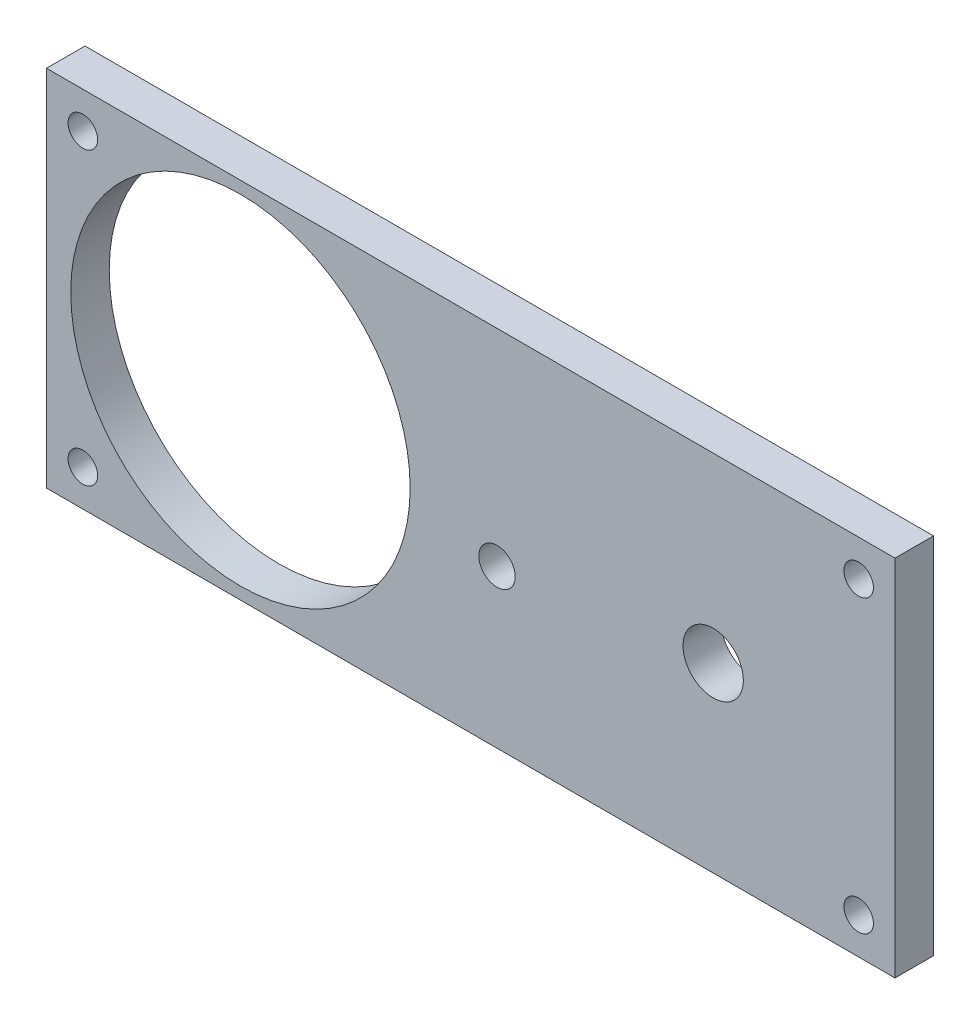
ISO-10303-21;
HEADER;
FILE_DESCRIPTION(('STEP AP214'),'2;1');
FILE_NAME('part.step','',(''),(''),'','','');
FILE_SCHEMA(('AUTOMOTIVE_DESIGN { 1 0 10303 214 1 1 1 1 }'));
ENDSEC;
DATA;
#1=APPLICATION_CONTEXT('core data for automotive mechanical design processes');
#2=APPLICATION_PROTOCOL_DEFINITION('international standard','automotive_design',2000,#1);
#3=PRODUCT_CONTEXT('',#1,'mechanical');
#4=PRODUCT('Part','Part','',(#3));
#5=PRODUCT_RELATED_PRODUCT_CATEGORY('part','',(#4));
#6=PRODUCT_DEFINITION_FORMATION('','',#4);
#7=PRODUCT_DEFINITION_CONTEXT('part definition',#1,'design');
#8=PRODUCT_DEFINITION('design','',#6,#7);
#9=PRODUCT_DEFINITION_SHAPE('','',#8);
#10=(LENGTH_UNIT() NAMED_UNIT(*) SI_UNIT(.MILLI.,.METRE.));
#11=(NAMED_UNIT(*) PLANE_ANGLE_UNIT() SI_UNIT($,.RADIAN.));
#12=(NAMED_UNIT(*) SI_UNIT($,.STERADIAN.) SOLID_ANGLE_UNIT());
#13=UNCERTAINTY_MEASURE_WITH_UNIT(LENGTH_MEASURE(1.E-05),#10,'distance_accuracy_value','');
#14=(GEOMETRIC_REPRESENTATION_CONTEXT(3) GLOBAL_UNCERTAINTY_ASSIGNED_CONTEXT((#13)) GLOBAL_UNIT_ASSIGNED_CONTEXT((#10,
#11,#12)) REPRESENTATION_CONTEXT('',''));
#15=CARTESIAN_POINT('',(0.,0.,0.));
#16=DIRECTION('',(0.,0.,1.));
#17=DIRECTION('',(1.,0.,0.));
#18=AXIS2_PLACEMENT_3D('',#15,#16,#17);
#19=CARTESIAN_POINT('',(0.,0.,3.175));
#20=DIRECTION('',(0.,0.,-1.));
#21=DIRECTION('',(-1.,0.,0.));
#22=AXIS2_PLACEMENT_3D('',#19,#20,#21);
#23=PLANE('',#22);
#24=CARTESIAN_POINT('',(67.,3.,3.175));
#25=DIRECTION('',(0.,0.,1.));
#26=DIRECTION('',(1.,0.,0.));
#27=AXIS2_PLACEMENT_3D('',#24,#25,#26);
#28=CIRCLE('',#27,1.2192);
#29=CARTESIAN_POINT('',(68.2192,3.,3.175));
#30=VERTEX_POINT('',#29);
#31=EDGE_CURVE('E152',#30,#30,#28,.T.);
#32=ORIENTED_EDGE('',*,*,#31,.F.);
#33=EDGE_LOOP('',(#32));
#34=FACE_BOUND('',#33,.T.);
#35=CARTESIAN_POINT('',(67.,27.,3.175));
#36=DIRECTION('',(0.,0.,1.));
#37=DIRECTION('',(1.,0.,0.));
#38=AXIS2_PLACEMENT_3D('',#35,#36,#37);
#39=CIRCLE('',#38,1.2192);
#40=CARTESIAN_POINT('',(68.2192,27.,3.175));
#41=VERTEX_POINT('',#40);
#42=EDGE_CURVE('E146',#41,#41,#39,.T.);
#43=ORIENTED_EDGE('',*,*,#42,.F.);
#44=EDGE_LOOP('',(#43));
#45=FACE_BOUND('',#44,.T.);
#46=CARTESIAN_POINT('',(3.,27.,3.175));
#47=DIRECTION('',(0.,0.,1.));
#48=DIRECTION('',(1.,0.,0.));
#49=AXIS2_PLACEMENT_3D('',#46,#47,#48);
#50=CIRCLE('',#49,1.2192);
#51=CARTESIAN_POINT('',(4.2192,27.,3.175));
#52=VERTEX_POINT('',#51);
#53=EDGE_CURVE('E140',#52,#52,#50,.T.);
#54=ORIENTED_EDGE('',*,*,#53,.F.);
#55=EDGE_LOOP('',(#54));
#56=FACE_BOUND('',#55,.T.);
#57=CARTESIAN_POINT('',(3.,3.,3.175));
#58=DIRECTION('',(0.,0.,1.));
#59=DIRECTION('',(1.,0.,0.));
#60=AXIS2_PLACEMENT_3D('',#57,#58,#59);
#61=CIRCLE('',#60,1.2192);
#62=CARTESIAN_POINT('',(4.2192,3.,3.175));
#63=VERTEX_POINT('',#62);
#64=EDGE_CURVE('E134',#63,#63,#61,.T.);
#65=ORIENTED_EDGE('',*,*,#64,.F.);
#66=EDGE_LOOP('',(#65));
#67=FACE_BOUND('',#66,.T.);
#68=CARTESIAN_POINT('',(37.1666992956996,13.,3.175));
#69=DIRECTION('',(0.,0.,1.));
#70=DIRECTION('',(1.,0.,0.));
#71=AXIS2_PLACEMENT_3D('',#68,#69,#70);
#72=CIRCLE('',#71,1.49860000000001);
#73=CARTESIAN_POINT('',(38.6652992956997,13.,3.175));
#74=VERTEX_POINT('',#73);
#75=EDGE_CURVE('E117',#74,#74,#72,.T.);
#76=ORIENTED_EDGE('',*,*,#75,.F.);
#77=EDGE_LOOP('',(#76));
#78=FACE_BOUND('',#77,.T.);
#79=DIRECTION('',(0.,-1.,0.));
#80=VECTOR('',#79,1.);
#81=CARTESIAN_POINT('',(0.,0.,3.175));
#82=LINE('',#81,#80);
#83=CARTESIAN_POINT('',(0.,30.,3.175));
#84=VERTEX_POINT('',#83);
#85=CARTESIAN_POINT('',(0.,0.,3.175));
#86=VERTEX_POINT('',#85);
#87=EDGE_CURVE('E87',#84,#86,#82,.T.);
#88=ORIENTED_EDGE('',*,*,#87,.T.);
#89=DIRECTION('',(1.,0.,0.));
#90=VECTOR('',#89,1.);
#91=CARTESIAN_POINT('',(0.,0.,3.175));
#92=LINE('',#91,#90);
#93=CARTESIAN_POINT('',(70.,0.,3.175));
#94=VERTEX_POINT('',#93);
#95=EDGE_CURVE('E82',#86,#94,#92,.T.);
#96=ORIENTED_EDGE('',*,*,#95,.T.);
#97=DIRECTION('',(0.,1.,0.));
#98=VECTOR('',#97,1.);
#99=CARTESIAN_POINT('',(70.,0.,3.175));
#100=LINE('',#99,#98);
#101=CARTESIAN_POINT('',(70.,30.,3.175));
#102=VERTEX_POINT('',#101);
#103=EDGE_CURVE('E85',#94,#102,#100,.T.);
#104=ORIENTED_EDGE('',*,*,#103,.T.);
#105=DIRECTION('',(-1.,0.,0.));
#106=VECTOR('',#105,1.);
#107=CARTESIAN_POINT('',(0.,30.,3.175));
#108=LINE('',#107,#106);
#109=EDGE_CURVE('E52',#102,#84,#108,.T.);
#110=ORIENTED_EDGE('',*,*,#109,.T.);
#111=EDGE_LOOP('',(#88,#96,#104,#110));
#112=FACE_BOUND('',#111,.T.);
#113=CARTESIAN_POINT('',(55.,15.,3.175));
#114=DIRECTION('',(0.,0.,1.));
#115=DIRECTION('',(1.,0.,0.));
#116=AXIS2_PLACEMENT_3D('',#113,#114,#115);
#117=CIRCLE('',#116,2.4892);
#118=CARTESIAN_POINT('',(57.4892,15.,3.175));
#119=VERTEX_POINT('',#118);
#120=EDGE_CURVE('E102',#119,#119,#117,.T.);
#121=ORIENTED_EDGE('',*,*,#120,.F.);
#122=EDGE_LOOP('',(#121));
#123=FACE_BOUND('',#122,.T.);
#124=CARTESIAN_POINT('',(16.,15.,3.175));
#125=DIRECTION('',(0.,0.,1.));
#126=DIRECTION('',(1.,0.,0.));
#127=AXIS2_PLACEMENT_3D('',#124,#125,#126);
#128=CIRCLE('',#127,14.);
#129=CARTESIAN_POINT('',(30.,15.,3.175));
#130=VERTEX_POINT('',#129);
#131=EDGE_CURVE('E123',#130,#130,#128,.T.);
#132=ORIENTED_EDGE('',*,*,#131,.F.);
#133=EDGE_LOOP('',(#132));
#134=FACE_BOUND('',#133,.T.);
#135=ADVANCED_FACE('F35',(#34,#45,#56,#67,#78,#112,#123,#134),#23,.F.);
#136=CARTESIAN_POINT('',(0.,0.,0.));
#137=DIRECTION('',(0.,0.,-1.));
#138=DIRECTION('',(-1.,0.,0.));
#139=AXIS2_PLACEMENT_3D('',#136,#137,#138);
#140=PLANE('',#139);
#141=CARTESIAN_POINT('',(67.,3.,0.));
#142=DIRECTION('',(0.,0.,1.));
#143=DIRECTION('',(1.,0.,0.));
#144=AXIS2_PLACEMENT_3D('',#141,#142,#143);
#145=CIRCLE('',#144,1.2192);
#146=CARTESIAN_POINT('',(68.2192,3.,0.));
#147=VERTEX_POINT('',#146);
#148=EDGE_CURVE('E149',#147,#147,#145,.T.);
#149=ORIENTED_EDGE('',*,*,#148,.T.);
#150=EDGE_LOOP('',(#149));
#151=FACE_BOUND('',#150,.T.);
#152=CARTESIAN_POINT('',(67.,27.,0.));
#153=DIRECTION('',(0.,0.,1.));
#154=DIRECTION('',(1.,0.,0.));
#155=AXIS2_PLACEMENT_3D('',#152,#153,#154);
#156=CIRCLE('',#155,1.2192);
#157=CARTESIAN_POINT('',(68.2192,27.,0.));
#158=VERTEX_POINT('',#157);
#159=EDGE_CURVE('E143',#158,#158,#156,.T.);
#160=ORIENTED_EDGE('',*,*,#159,.T.);
#161=EDGE_LOOP('',(#160));
#162=FACE_BOUND('',#161,.T.);
#163=CARTESIAN_POINT('',(3.,27.,0.));
#164=DIRECTION('',(0.,0.,1.));
#165=DIRECTION('',(1.,0.,0.));
#166=AXIS2_PLACEMENT_3D('',#163,#164,#165);
#167=CIRCLE('',#166,1.2192);
#168=CARTESIAN_POINT('',(4.2192,27.,0.));
#169=VERTEX_POINT('',#168);
#170=EDGE_CURVE('E137',#169,#169,#167,.T.);
#171=ORIENTED_EDGE('',*,*,#170,.T.);
#172=EDGE_LOOP('',(#171));
#173=FACE_BOUND('',#172,.T.);
#174=CARTESIAN_POINT('',(3.,3.,0.));
#175=DIRECTION('',(0.,0.,1.));
#176=DIRECTION('',(1.,0.,0.));
#177=AXIS2_PLACEMENT_3D('',#174,#175,#176);
#178=CIRCLE('',#177,1.2192);
#179=CARTESIAN_POINT('',(4.2192,3.,0.));
#180=VERTEX_POINT('',#179);
#181=EDGE_CURVE('E129',#180,#180,#178,.T.);
#182=ORIENTED_EDGE('',*,*,#181,.T.);
#183=EDGE_LOOP('',(#182));
#184=FACE_BOUND('',#183,.T.);
#185=CARTESIAN_POINT('',(37.1666992956996,13.,0.));
#186=DIRECTION('',(0.,0.,1.));
#187=DIRECTION('',(1.,0.,0.));
#188=AXIS2_PLACEMENT_3D('',#185,#186,#187);
#189=CIRCLE('',#188,1.49860000000001);
#190=CARTESIAN_POINT('',(38.6652992956997,13.,0.));
#191=VERTEX_POINT('',#190);
#192=EDGE_CURVE('E120',#191,#191,#189,.T.);
#193=ORIENTED_EDGE('',*,*,#192,.T.);
#194=EDGE_LOOP('',(#193));
#195=FACE_BOUND('',#194,.T.);
#196=DIRECTION('',(0.,-1.,0.));
#197=VECTOR('',#196,1.);
#198=CARTESIAN_POINT('',(0.,0.,0.));
#199=LINE('',#198,#197);
#200=CARTESIAN_POINT('',(0.,30.,0.));
#201=VERTEX_POINT('',#200);
#202=CARTESIAN_POINT('',(0.,0.,0.));
#203=VERTEX_POINT('',#202);
#204=EDGE_CURVE('E99',#201,#203,#199,.T.);
#205=ORIENTED_EDGE('',*,*,#204,.F.);
#206=DIRECTION('',(-1.,0.,0.));
#207=VECTOR('',#206,1.);
#208=CARTESIAN_POINT('',(0.,30.,0.));
#209=LINE('',#208,#207);
#210=CARTESIAN_POINT('',(70.,30.,0.));
#211=VERTEX_POINT('',#210);
#212=EDGE_CURVE('E75',#211,#201,#209,.T.);
#213=ORIENTED_EDGE('',*,*,#212,.F.);
#214=DIRECTION('',(0.,1.,0.));
#215=VECTOR('',#214,1.);
#216=CARTESIAN_POINT('',(70.,0.,0.));
#217=LINE('',#216,#215);
#218=CARTESIAN_POINT('',(70.,0.,0.));
#219=VERTEX_POINT('',#218);
#220=EDGE_CURVE('E69',#219,#211,#217,.T.);
#221=ORIENTED_EDGE('',*,*,#220,.F.);
#222=DIRECTION('',(1.,0.,0.));
#223=VECTOR('',#222,1.);
#224=CARTESIAN_POINT('',(0.,0.,0.));
#225=LINE('',#224,#223);
#226=EDGE_CURVE('E91',#203,#219,#225,.T.);
#227=ORIENTED_EDGE('',*,*,#226,.F.);
#228=EDGE_LOOP('',(#205,#213,#221,#227));
#229=FACE_BOUND('',#228,.T.);
#230=CARTESIAN_POINT('',(55.,15.,0.));
#231=DIRECTION('',(0.,0.,1.));
#232=DIRECTION('',(1.,0.,0.));
#233=AXIS2_PLACEMENT_3D('',#230,#231,#232);
#234=CIRCLE('',#233,2.4892);
#235=CARTESIAN_POINT('',(57.4892,15.,0.));
#236=VERTEX_POINT('',#235);
#237=EDGE_CURVE('E114',#236,#236,#234,.T.);
#238=ORIENTED_EDGE('',*,*,#237,.T.);
#239=EDGE_LOOP('',(#238));
#240=FACE_BOUND('',#239,.T.);
#241=CARTESIAN_POINT('',(16.,15.,0.));
#242=DIRECTION('',(0.,0.,1.));
#243=DIRECTION('',(1.,0.,0.));
#244=AXIS2_PLACEMENT_3D('',#241,#242,#243);
#245=CIRCLE('',#244,14.);
#246=CARTESIAN_POINT('',(30.,15.,0.));
#247=VERTEX_POINT('',#246);
#248=EDGE_CURVE('E126',#247,#247,#245,.T.);
#249=ORIENTED_EDGE('',*,*,#248,.T.);
#250=EDGE_LOOP('',(#249));
#251=FACE_BOUND('',#250,.T.);
#252=ADVANCED_FACE('F110',(#151,#162,#173,#184,#195,#229,#240,#251),#140,.T.);
#253=CARTESIAN_POINT('',(0.,0.,3.175));
#254=DIRECTION('',(1.,0.,0.));
#255=DIRECTION('',(0.,0.,-1.));
#256=AXIS2_PLACEMENT_3D('',#253,#254,#255);
#257=PLANE('',#256);
#258=ORIENTED_EDGE('',*,*,#204,.T.);
#259=DIRECTION('',(0.,0.,-1.));
#260=VECTOR('',#259,1.);
#261=CARTESIAN_POINT('',(0.,0.,3.175));
#262=LINE('',#261,#260);
#263=EDGE_CURVE('E11',#86,#203,#262,.T.);
#264=ORIENTED_EDGE('',*,*,#263,.F.);
#265=ORIENTED_EDGE('',*,*,#87,.F.);
#266=DIRECTION('',(0.,0.,-1.));
#267=VECTOR('',#266,1.);
#268=CARTESIAN_POINT('',(0.,30.,3.175));
#269=LINE('',#268,#267);
#270=EDGE_CURVE('E95',#84,#201,#269,.T.);
#271=ORIENTED_EDGE('',*,*,#270,.T.);
#272=EDGE_LOOP('',(#258,#264,#265,#271));
#273=FACE_BOUND('',#272,.T.);
#274=ADVANCED_FACE('F37',(#273),#257,.F.);
#275=CARTESIAN_POINT('',(0.,0.,3.175));
#276=DIRECTION('',(0.,1.,0.));
#277=DIRECTION('',(0.,0.,1.));
#278=AXIS2_PLACEMENT_3D('',#275,#276,#277);
#279=PLANE('',#278);
#280=ORIENTED_EDGE('',*,*,#226,.T.);
#281=DIRECTION('',(0.,0.,-1.));
#282=VECTOR('',#281,1.);
#283=CARTESIAN_POINT('',(70.,0.,3.175));
#284=LINE('',#283,#282);
#285=EDGE_CURVE('E44',#94,#219,#284,.T.);
#286=ORIENTED_EDGE('',*,*,#285,.F.);
#287=ORIENTED_EDGE('',*,*,#95,.F.);
#288=ORIENTED_EDGE('',*,*,#263,.T.);
#289=EDGE_LOOP('',(#280,#286,#287,#288));
#290=FACE_BOUND('',#289,.T.);
#291=ADVANCED_FACE('F90',(#290),#279,.F.);
#292=CARTESIAN_POINT('',(70.,0.,3.175));
#293=DIRECTION('',(-1.,0.,0.));
#294=DIRECTION('',(0.,0.,1.));
#295=AXIS2_PLACEMENT_3D('',#292,#293,#294);
#296=PLANE('',#295);
#297=ORIENTED_EDGE('',*,*,#220,.T.);
#298=DIRECTION('',(0.,0.,-1.));
#299=VECTOR('',#298,1.);
#300=CARTESIAN_POINT('',(70.,30.,3.175));
#301=LINE('',#300,#299);
#302=EDGE_CURVE('E92',#102,#211,#301,.T.);
#303=ORIENTED_EDGE('',*,*,#302,.F.);
#304=ORIENTED_EDGE('',*,*,#103,.F.);
#305=ORIENTED_EDGE('',*,*,#285,.T.);
#306=EDGE_LOOP('',(#297,#303,#304,#305));
#307=FACE_BOUND('',#306,.T.);
#308=ADVANCED_FACE('F93',(#307),#296,.F.);
#309=CARTESIAN_POINT('',(0.,30.,3.175));
#310=DIRECTION('',(0.,-1.,0.));
#311=DIRECTION('',(0.,0.,-1.));
#312=AXIS2_PLACEMENT_3D('',#309,#310,#311);
#313=PLANE('',#312);
#314=ORIENTED_EDGE('',*,*,#212,.T.);
#315=ORIENTED_EDGE('',*,*,#270,.F.);
#316=ORIENTED_EDGE('',*,*,#109,.F.);
#317=ORIENTED_EDGE('',*,*,#302,.T.);
#318=EDGE_LOOP('',(#314,#315,#316,#317));
#319=FACE_BOUND('',#318,.T.);
#320=ADVANCED_FACE('F107',(#319),#313,.F.);
#321=CARTESIAN_POINT('',(55.,15.,3.175));
#322=DIRECTION('',(0.,0.,-1.));
#323=DIRECTION('',(-1.,0.,0.));
#324=AXIS2_PLACEMENT_3D('',#321,#322,#323);
#325=CYLINDRICAL_SURFACE('',#324,2.4892);
#326=ORIENTED_EDGE('',*,*,#120,.T.);
#327=EDGE_LOOP('',(#326));
#328=FACE_BOUND('',#327,.T.);
#329=ORIENTED_EDGE('',*,*,#237,.F.);
#330=EDGE_LOOP('',(#329));
#331=FACE_BOUND('',#330,.T.);
#332=ADVANCED_FACE('F173',(#328,#331),#325,.F.);
#333=CARTESIAN_POINT('',(37.1666992956996,13.,3.175));
#334=DIRECTION('',(0.,0.,-1.));
#335=DIRECTION('',(-1.,0.,0.));
#336=AXIS2_PLACEMENT_3D('',#333,#334,#335);
#337=CYLINDRICAL_SURFACE('',#336,1.49860000000001);
#338=ORIENTED_EDGE('',*,*,#75,.T.);
#339=EDGE_LOOP('',(#338));
#340=FACE_BOUND('',#339,.T.);
#341=ORIENTED_EDGE('',*,*,#192,.F.);
#342=EDGE_LOOP('',(#341));
#343=FACE_BOUND('',#342,.T.);
#344=ADVANCED_FACE('F169',(#340,#343),#337,.F.);
#345=CARTESIAN_POINT('',(16.,15.,3.175));
#346=DIRECTION('',(0.,0.,-1.));
#347=DIRECTION('',(-1.,0.,0.));
#348=AXIS2_PLACEMENT_3D('',#345,#346,#347);
#349=CYLINDRICAL_SURFACE('',#348,14.);
#350=ORIENTED_EDGE('',*,*,#131,.T.);
#351=EDGE_LOOP('',(#350));
#352=FACE_BOUND('',#351,.T.);
#353=ORIENTED_EDGE('',*,*,#248,.F.);
#354=EDGE_LOOP('',(#353));
#355=FACE_BOUND('',#354,.T.);
#356=ADVANCED_FACE('F172',(#352,#355),#349,.F.);
#357=CARTESIAN_POINT('',(3.,3.,3.175));
#358=DIRECTION('',(0.,0.,1.));
#359=DIRECTION('',(1.,0.,0.));
#360=AXIS2_PLACEMENT_3D('',#357,#358,#359);
#361=CYLINDRICAL_SURFACE('',#360,1.2192);
#362=ORIENTED_EDGE('',*,*,#181,.F.);
#363=EDGE_LOOP('',(#362));
#364=FACE_BOUND('',#363,.T.);
#365=ORIENTED_EDGE('',*,*,#64,.T.);
#366=EDGE_LOOP('',(#365));
#367=FACE_BOUND('',#366,.T.);
#368=ADVANCED_FACE('F218',(#364,#367),#361,.F.);
#369=CARTESIAN_POINT('',(3.,27.,3.175));
#370=DIRECTION('',(0.,0.,1.));
#371=DIRECTION('',(1.,0.,0.));
#372=AXIS2_PLACEMENT_3D('',#369,#370,#371);
#373=CYLINDRICAL_SURFACE('',#372,1.2192);
#374=ORIENTED_EDGE('',*,*,#170,.F.);
#375=EDGE_LOOP('',(#374));
#376=FACE_BOUND('',#375,.T.);
#377=ORIENTED_EDGE('',*,*,#53,.T.);
#378=EDGE_LOOP('',(#377));
#379=FACE_BOUND('',#378,.T.);
#380=ADVANCED_FACE('F227',(#376,#379),#373,.F.);
#381=CARTESIAN_POINT('',(67.,27.,3.175));
#382=DIRECTION('',(0.,0.,1.));
#383=DIRECTION('',(1.,0.,0.));
#384=AXIS2_PLACEMENT_3D('',#381,#382,#383);
#385=CYLINDRICAL_SURFACE('',#384,1.2192);
#386=ORIENTED_EDGE('',*,*,#159,.F.);
#387=EDGE_LOOP('',(#386));
#388=FACE_BOUND('',#387,.T.);
#389=ORIENTED_EDGE('',*,*,#42,.T.);
#390=EDGE_LOOP('',(#389));
#391=FACE_BOUND('',#390,.T.);
#392=ADVANCED_FACE('F235',(#388,#391),#385,.F.);
#393=CARTESIAN_POINT('',(67.,3.,3.175));
#394=DIRECTION('',(0.,0.,1.));
#395=DIRECTION('',(1.,0.,0.));
#396=AXIS2_PLACEMENT_3D('',#393,#394,#395);
#397=CYLINDRICAL_SURFACE('',#396,1.2192);
#398=ORIENTED_EDGE('',*,*,#148,.F.);
#399=EDGE_LOOP('',(#398));
#400=FACE_BOUND('',#399,.T.);
#401=ORIENTED_EDGE('',*,*,#31,.T.);
#402=EDGE_LOOP('',(#401));
#403=FACE_BOUND('',#402,.T.);
#404=ADVANCED_FACE('F156',(#400,#403),#397,.F.);
#405=CLOSED_SHELL('',(#135,#252,#274,#291,#308,#320,#332,#344,#356,#368,#380,#392,#404));
#406=MANIFOLD_SOLID_BREP('B2',#405);
#407=ADVANCED_BREP_SHAPE_REPRESENTATION('',(#18,#406),#14);
#408=SHAPE_DEFINITION_REPRESENTATION(#9,#407);
ENDSEC;
END-ISO-10303-21;
